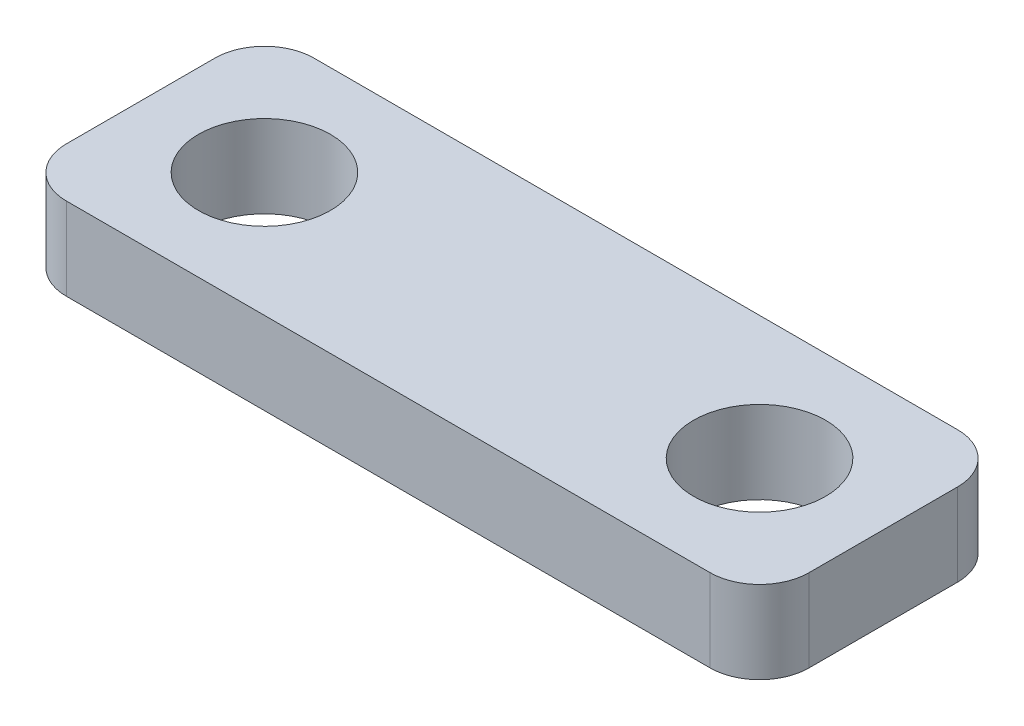
ISO-10303-21;
HEADER;
FILE_DESCRIPTION(('STEP AP214'),'2;1');
FILE_NAME('part.step','',(''),(''),'','','');
FILE_SCHEMA(('AUTOMOTIVE_DESIGN { 1 0 10303 214 1 1 1 1 }'));
ENDSEC;
DATA;
#1=APPLICATION_CONTEXT('core data for automotive mechanical design processes');
#2=APPLICATION_PROTOCOL_DEFINITION('international standard','automotive_design',2000,#1);
#3=PRODUCT_CONTEXT('',#1,'mechanical');
#4=PRODUCT('Part','Part','',(#3));
#5=PRODUCT_RELATED_PRODUCT_CATEGORY('part','',(#4));
#6=PRODUCT_DEFINITION_FORMATION('','',#4);
#7=PRODUCT_DEFINITION_CONTEXT('part definition',#1,'design');
#8=PRODUCT_DEFINITION('design','',#6,#7);
#9=PRODUCT_DEFINITION_SHAPE('','',#8);
#10=(LENGTH_UNIT() NAMED_UNIT(*) SI_UNIT(.MILLI.,.METRE.));
#11=(NAMED_UNIT(*) PLANE_ANGLE_UNIT() SI_UNIT($,.RADIAN.));
#12=(NAMED_UNIT(*) SI_UNIT($,.STERADIAN.) SOLID_ANGLE_UNIT());
#13=UNCERTAINTY_MEASURE_WITH_UNIT(LENGTH_MEASURE(1.E-05),#10,'distance_accuracy_value','');
#14=(GEOMETRIC_REPRESENTATION_CONTEXT(3) GLOBAL_UNCERTAINTY_ASSIGNED_CONTEXT((#13)) GLOBAL_UNIT_ASSIGNED_CONTEXT((#10,
#11,#12)) REPRESENTATION_CONTEXT('',''));
#15=CARTESIAN_POINT('',(0.,0.,0.));
#16=DIRECTION('',(0.,0.,1.));
#17=DIRECTION('',(1.,0.,0.));
#18=AXIS2_PLACEMENT_3D('',#15,#16,#17);
#19=CARTESIAN_POINT('',(22.5,5.,7.5));
#20=DIRECTION('',(-1.,0.,0.));
#21=DIRECTION('',(0.,0.,1.));
#22=AXIS2_PLACEMENT_3D('',#19,#20,#21);
#23=PLANE('',#22);
#24=DIRECTION('',(0.,0.,-1.));
#25=VECTOR('',#24,1.);
#26=CARTESIAN_POINT('',(22.5,5.,7.5));
#27=LINE('',#26,#25);
#28=CARTESIAN_POINT('',(22.5,5.,4.5));
#29=VERTEX_POINT('',#28);
#30=CARTESIAN_POINT('',(22.5,5.,-4.5));
#31=VERTEX_POINT('',#30);
#32=EDGE_CURVE('E128',#29,#31,#27,.T.);
#33=ORIENTED_EDGE('',*,*,#32,.F.);
#34=DIRECTION('',(0.,-1.,0.));
#35=VECTOR('',#34,1.);
#36=CARTESIAN_POINT('',(22.5,5.,4.5));
#37=LINE('',#36,#35);
#38=CARTESIAN_POINT('',(22.5,0.,4.5));
#39=VERTEX_POINT('',#38);
#40=EDGE_CURVE('E154',#29,#39,#37,.T.);
#41=ORIENTED_EDGE('',*,*,#40,.T.);
#42=DIRECTION('',(0.,0.,-1.));
#43=VECTOR('',#42,1.);
#44=CARTESIAN_POINT('',(22.5,0.,7.5));
#45=LINE('',#44,#43);
#46=CARTESIAN_POINT('',(22.5,0.,-4.5));
#47=VERTEX_POINT('',#46);
#48=EDGE_CURVE('E170',#39,#47,#45,.T.);
#49=ORIENTED_EDGE('',*,*,#48,.T.);
#50=DIRECTION('',(0.,-1.,0.));
#51=VECTOR('',#50,1.);
#52=CARTESIAN_POINT('',(22.5,5.,-4.5));
#53=LINE('',#52,#51);
#54=EDGE_CURVE('E152',#47,#31,#53,.F.);
#55=ORIENTED_EDGE('',*,*,#54,.T.);
#56=EDGE_LOOP('',(#33,#41,#49,#55));
#57=FACE_BOUND('',#56,.T.);
#58=ADVANCED_FACE('F34',(#57),#23,.F.);
#59=CARTESIAN_POINT('',(-22.5,5.,-7.5));
#60=DIRECTION('',(0.,0.,1.));
#61=DIRECTION('',(1.,0.,0.));
#62=AXIS2_PLACEMENT_3D('',#59,#60,#61);
#63=PLANE('',#62);
#64=DIRECTION('',(-1.,0.,0.));
#65=VECTOR('',#64,1.);
#66=CARTESIAN_POINT('',(-22.5,5.,-7.5));
#67=LINE('',#66,#65);
#68=CARTESIAN_POINT('',(19.5,5.,-7.5));
#69=VERTEX_POINT('',#68);
#70=CARTESIAN_POINT('',(-19.5,5.,-7.5));
#71=VERTEX_POINT('',#70);
#72=EDGE_CURVE('E131',#69,#71,#67,.T.);
#73=ORIENTED_EDGE('',*,*,#72,.F.);
#74=DIRECTION('',(0.,-1.,0.));
#75=VECTOR('',#74,1.);
#76=CARTESIAN_POINT('',(19.5,5.,-7.5));
#77=LINE('',#76,#75);
#78=CARTESIAN_POINT('',(19.5,0.,-7.5));
#79=VERTEX_POINT('',#78);
#80=EDGE_CURVE('E11',#69,#79,#77,.T.);
#81=ORIENTED_EDGE('',*,*,#80,.T.);
#82=DIRECTION('',(-1.,0.,0.));
#83=VECTOR('',#82,1.);
#84=CARTESIAN_POINT('',(-22.5,0.,-7.5));
#85=LINE('',#84,#83);
#86=CARTESIAN_POINT('',(-19.5,0.,-7.5));
#87=VERTEX_POINT('',#86);
#88=EDGE_CURVE('E133',#79,#87,#85,.T.);
#89=ORIENTED_EDGE('',*,*,#88,.T.);
#90=DIRECTION('',(0.,-1.,0.));
#91=VECTOR('',#90,1.);
#92=CARTESIAN_POINT('',(-19.5,5.,-7.5));
#93=LINE('',#92,#91);
#94=EDGE_CURVE('E43',#87,#71,#93,.F.);
#95=ORIENTED_EDGE('',*,*,#94,.T.);
#96=EDGE_LOOP('',(#73,#81,#89,#95));
#97=FACE_BOUND('',#96,.T.);
#98=ADVANCED_FACE('F179',(#97),#63,.F.);
#99=CARTESIAN_POINT('',(-22.5,5.,7.5));
#100=DIRECTION('',(1.,0.,0.));
#101=DIRECTION('',(0.,0.,-1.));
#102=AXIS2_PLACEMENT_3D('',#99,#100,#101);
#103=PLANE('',#102);
#104=DIRECTION('',(0.,0.,1.));
#105=VECTOR('',#104,1.);
#106=CARTESIAN_POINT('',(-22.5,0.,7.5));
#107=LINE('',#106,#105);
#108=CARTESIAN_POINT('',(-22.5,0.,-4.5));
#109=VERTEX_POINT('',#108);
#110=CARTESIAN_POINT('',(-22.5,0.,4.5));
#111=VERTEX_POINT('',#110);
#112=EDGE_CURVE('E129',#109,#111,#107,.T.);
#113=ORIENTED_EDGE('',*,*,#112,.T.);
#114=DIRECTION('',(0.,-1.,0.));
#115=VECTOR('',#114,1.);
#116=CARTESIAN_POINT('',(-22.5,5.,4.5));
#117=LINE('',#116,#115);
#118=CARTESIAN_POINT('',(-22.5,5.,4.5));
#119=VERTEX_POINT('',#118);
#120=EDGE_CURVE('E107',#111,#119,#117,.F.);
#121=ORIENTED_EDGE('',*,*,#120,.T.);
#122=DIRECTION('',(0.,0.,1.));
#123=VECTOR('',#122,1.);
#124=CARTESIAN_POINT('',(-22.5,5.,7.5));
#125=LINE('',#124,#123);
#126=CARTESIAN_POINT('',(-22.5,5.,-4.5));
#127=VERTEX_POINT('',#126);
#128=EDGE_CURVE('E173',#127,#119,#125,.T.);
#129=ORIENTED_EDGE('',*,*,#128,.F.);
#130=DIRECTION('',(0.,-1.,0.));
#131=VECTOR('',#130,1.);
#132=CARTESIAN_POINT('',(-22.5,5.,-4.5));
#133=LINE('',#132,#131);
#134=EDGE_CURVE('E112',#127,#109,#133,.T.);
#135=ORIENTED_EDGE('',*,*,#134,.T.);
#136=EDGE_LOOP('',(#113,#121,#129,#135));
#137=FACE_BOUND('',#136,.T.);
#138=ADVANCED_FACE('F187',(#137),#103,.F.);
#139=CARTESIAN_POINT('',(-22.5,5.,7.5));
#140=DIRECTION('',(0.,0.,-1.));
#141=DIRECTION('',(-1.,0.,0.));
#142=AXIS2_PLACEMENT_3D('',#139,#140,#141);
#143=PLANE('',#142);
#144=DIRECTION('',(1.,0.,0.));
#145=VECTOR('',#144,1.);
#146=CARTESIAN_POINT('',(-22.5,5.,7.5));
#147=LINE('',#146,#145);
#148=CARTESIAN_POINT('',(-19.5,5.,7.5));
#149=VERTEX_POINT('',#148);
#150=CARTESIAN_POINT('',(19.5,5.,7.5));
#151=VERTEX_POINT('',#150);
#152=EDGE_CURVE('E122',#149,#151,#147,.T.);
#153=ORIENTED_EDGE('',*,*,#152,.F.);
#154=DIRECTION('',(0.,-1.,0.));
#155=VECTOR('',#154,1.);
#156=CARTESIAN_POINT('',(-19.5,5.,7.5));
#157=LINE('',#156,#155);
#158=CARTESIAN_POINT('',(-19.5,0.,7.5));
#159=VERTEX_POINT('',#158);
#160=EDGE_CURVE('E106',#149,#159,#157,.T.);
#161=ORIENTED_EDGE('',*,*,#160,.T.);
#162=DIRECTION('',(1.,0.,0.));
#163=VECTOR('',#162,1.);
#164=CARTESIAN_POINT('',(-22.5,0.,7.5));
#165=LINE('',#164,#163);
#166=CARTESIAN_POINT('',(19.5,0.,7.5));
#167=VERTEX_POINT('',#166);
#168=EDGE_CURVE('E119',#159,#167,#165,.T.);
#169=ORIENTED_EDGE('',*,*,#168,.T.);
#170=DIRECTION('',(0.,-1.,0.));
#171=VECTOR('',#170,1.);
#172=CARTESIAN_POINT('',(19.5,5.,7.5));
#173=LINE('',#172,#171);
#174=EDGE_CURVE('E124',#167,#151,#173,.F.);
#175=ORIENTED_EDGE('',*,*,#174,.T.);
#176=EDGE_LOOP('',(#153,#161,#169,#175));
#177=FACE_BOUND('',#176,.T.);
#178=ADVANCED_FACE('F118',(#177),#143,.F.);
#179=CARTESIAN_POINT('',(0.,5.,0.));
#180=DIRECTION('',(0.,-1.,0.));
#181=DIRECTION('',(0.,0.,-1.));
#182=AXIS2_PLACEMENT_3D('',#179,#180,#181);
#183=PLANE('',#182);
#184=CARTESIAN_POINT('',(-15.,5.,0.));
#185=DIRECTION('',(0.,-1.,0.));
#186=DIRECTION('',(0.,0.,-1.));
#187=AXIS2_PLACEMENT_3D('',#184,#185,#186);
#188=CIRCLE('',#187,4.);
#189=CARTESIAN_POINT('',(-15.,5.,-4.));
#190=VERTEX_POINT('',#189);
#191=EDGE_CURVE('E167',#190,#190,#188,.T.);
#192=ORIENTED_EDGE('',*,*,#191,.T.);
#193=EDGE_LOOP('',(#192));
#194=FACE_BOUND('',#193,.T.);
#195=CARTESIAN_POINT('',(15.,5.,0.));
#196=DIRECTION('',(0.,-1.,0.));
#197=DIRECTION('',(0.,0.,-1.));
#198=AXIS2_PLACEMENT_3D('',#195,#196,#197);
#199=CIRCLE('',#198,4.);
#200=CARTESIAN_POINT('',(15.,5.,-4.));
#201=VERTEX_POINT('',#200);
#202=EDGE_CURVE('E159',#201,#201,#199,.T.);
#203=ORIENTED_EDGE('',*,*,#202,.T.);
#204=EDGE_LOOP('',(#203));
#205=FACE_BOUND('',#204,.T.);
#206=ORIENTED_EDGE('',*,*,#128,.T.);
#207=CARTESIAN_POINT('',(-19.5,5.,4.5));
#208=DIRECTION('',(0.,-1.,0.));
#209=DIRECTION('',(0.,0.,-1.));
#210=AXIS2_PLACEMENT_3D('',#207,#208,#209);
#211=CIRCLE('',#210,3.);
#212=EDGE_CURVE('E150',#119,#149,#211,.F.);
#213=ORIENTED_EDGE('',*,*,#212,.T.);
#214=ORIENTED_EDGE('',*,*,#152,.T.);
#215=CARTESIAN_POINT('',(19.5,5.,4.5));
#216=DIRECTION('',(0.,-1.,0.));
#217=DIRECTION('',(0.,0.,-1.));
#218=AXIS2_PLACEMENT_3D('',#215,#216,#217);
#219=CIRCLE('',#218,3.);
#220=EDGE_CURVE('E148',#151,#29,#219,.F.);
#221=ORIENTED_EDGE('',*,*,#220,.T.);
#222=ORIENTED_EDGE('',*,*,#32,.T.);
#223=CARTESIAN_POINT('',(19.5,5.,-4.5));
#224=DIRECTION('',(0.,-1.,0.));
#225=DIRECTION('',(0.,0.,-1.));
#226=AXIS2_PLACEMENT_3D('',#223,#224,#225);
#227=CIRCLE('',#226,3.);
#228=EDGE_CURVE('E57',#31,#69,#227,.F.);
#229=ORIENTED_EDGE('',*,*,#228,.T.);
#230=ORIENTED_EDGE('',*,*,#72,.T.);
#231=CARTESIAN_POINT('',(-19.5,5.,-4.5));
#232=DIRECTION('',(0.,-1.,0.));
#233=DIRECTION('',(0.,0.,-1.));
#234=AXIS2_PLACEMENT_3D('',#231,#232,#233);
#235=CIRCLE('',#234,3.);
#236=EDGE_CURVE('E145',#71,#127,#235,.F.);
#237=ORIENTED_EDGE('',*,*,#236,.T.);
#238=EDGE_LOOP('',(#206,#213,#214,#221,#222,#229,#230,#237));
#239=FACE_BOUND('',#238,.T.);
#240=ADVANCED_FACE('F185',(#194,#205,#239),#183,.F.);
#241=CARTESIAN_POINT('',(0.,0.,0.));
#242=DIRECTION('',(0.,-1.,0.));
#243=DIRECTION('',(0.,0.,-1.));
#244=AXIS2_PLACEMENT_3D('',#241,#242,#243);
#245=PLANE('',#244);
#246=CARTESIAN_POINT('',(-15.,0.,0.));
#247=DIRECTION('',(0.,-1.,0.));
#248=DIRECTION('',(0.,0.,-1.));
#249=AXIS2_PLACEMENT_3D('',#246,#247,#248);
#250=CIRCLE('',#249,4.);
#251=CARTESIAN_POINT('',(-15.,0.,-4.));
#252=VERTEX_POINT('',#251);
#253=EDGE_CURVE('E38',#252,#252,#250,.T.);
#254=ORIENTED_EDGE('',*,*,#253,.F.);
#255=EDGE_LOOP('',(#254));
#256=FACE_BOUND('',#255,.T.);
#257=CARTESIAN_POINT('',(15.,0.,0.));
#258=DIRECTION('',(0.,-1.,0.));
#259=DIRECTION('',(0.,0.,-1.));
#260=AXIS2_PLACEMENT_3D('',#257,#258,#259);
#261=CIRCLE('',#260,4.);
#262=CARTESIAN_POINT('',(15.,0.,-4.));
#263=VERTEX_POINT('',#262);
#264=EDGE_CURVE('E157',#263,#263,#261,.T.);
#265=ORIENTED_EDGE('',*,*,#264,.F.);
#266=EDGE_LOOP('',(#265));
#267=FACE_BOUND('',#266,.T.);
#268=ORIENTED_EDGE('',*,*,#168,.F.);
#269=CARTESIAN_POINT('',(-19.5,0.,4.5));
#270=DIRECTION('',(0.,-1.,0.));
#271=DIRECTION('',(0.,0.,-1.));
#272=AXIS2_PLACEMENT_3D('',#269,#270,#271);
#273=CIRCLE('',#272,3.);
#274=EDGE_CURVE('E102',#159,#111,#273,.T.);
#275=ORIENTED_EDGE('',*,*,#274,.T.);
#276=ORIENTED_EDGE('',*,*,#112,.F.);
#277=CARTESIAN_POINT('',(-19.5,0.,-4.5));
#278=DIRECTION('',(0.,-1.,0.));
#279=DIRECTION('',(0.,0.,-1.));
#280=AXIS2_PLACEMENT_3D('',#277,#278,#279);
#281=CIRCLE('',#280,3.);
#282=EDGE_CURVE('E123',#109,#87,#281,.T.);
#283=ORIENTED_EDGE('',*,*,#282,.T.);
#284=ORIENTED_EDGE('',*,*,#88,.F.);
#285=CARTESIAN_POINT('',(19.5,0.,-4.5));
#286=DIRECTION('',(0.,-1.,0.));
#287=DIRECTION('',(0.,0.,-1.));
#288=AXIS2_PLACEMENT_3D('',#285,#286,#287);
#289=CIRCLE('',#288,3.);
#290=EDGE_CURVE('E139',#79,#47,#289,.T.);
#291=ORIENTED_EDGE('',*,*,#290,.T.);
#292=ORIENTED_EDGE('',*,*,#48,.F.);
#293=CARTESIAN_POINT('',(19.5,0.,4.5));
#294=DIRECTION('',(0.,-1.,0.));
#295=DIRECTION('',(0.,0.,-1.));
#296=AXIS2_PLACEMENT_3D('',#293,#294,#295);
#297=CIRCLE('',#296,3.);
#298=EDGE_CURVE('E113',#39,#167,#297,.T.);
#299=ORIENTED_EDGE('',*,*,#298,.T.);
#300=EDGE_LOOP('',(#268,#275,#276,#283,#284,#291,#292,#299));
#301=FACE_BOUND('',#300,.T.);
#302=ADVANCED_FACE('F126',(#256,#267,#301),#245,.T.);
#303=CARTESIAN_POINT('',(-19.5,5.,4.5));
#304=DIRECTION('',(0.,-1.,0.));
#305=DIRECTION('',(0.,0.,-1.));
#306=AXIS2_PLACEMENT_3D('',#303,#304,#305);
#307=CYLINDRICAL_SURFACE('',#306,3.);
#308=ORIENTED_EDGE('',*,*,#212,.F.);
#309=ORIENTED_EDGE('',*,*,#120,.F.);
#310=ORIENTED_EDGE('',*,*,#274,.F.);
#311=ORIENTED_EDGE('',*,*,#160,.F.);
#312=EDGE_LOOP('',(#308,#309,#310,#311));
#313=FACE_BOUND('',#312,.T.);
#314=ADVANCED_FACE('F105',(#313),#307,.T.);
#315=CARTESIAN_POINT('',(19.5,5.,4.5));
#316=DIRECTION('',(0.,-1.,0.));
#317=DIRECTION('',(0.,0.,-1.));
#318=AXIS2_PLACEMENT_3D('',#315,#316,#317);
#319=CYLINDRICAL_SURFACE('',#318,3.);
#320=ORIENTED_EDGE('',*,*,#220,.F.);
#321=ORIENTED_EDGE('',*,*,#174,.F.);
#322=ORIENTED_EDGE('',*,*,#298,.F.);
#323=ORIENTED_EDGE('',*,*,#40,.F.);
#324=EDGE_LOOP('',(#320,#321,#322,#323));
#325=FACE_BOUND('',#324,.T.);
#326=ADVANCED_FACE('F205',(#325),#319,.T.);
#327=CARTESIAN_POINT('',(19.5,5.,-4.5));
#328=DIRECTION('',(0.,-1.,0.));
#329=DIRECTION('',(0.,0.,-1.));
#330=AXIS2_PLACEMENT_3D('',#327,#328,#329);
#331=CYLINDRICAL_SURFACE('',#330,3.);
#332=ORIENTED_EDGE('',*,*,#228,.F.);
#333=ORIENTED_EDGE('',*,*,#54,.F.);
#334=ORIENTED_EDGE('',*,*,#290,.F.);
#335=ORIENTED_EDGE('',*,*,#80,.F.);
#336=EDGE_LOOP('',(#332,#333,#334,#335));
#337=FACE_BOUND('',#336,.T.);
#338=ADVANCED_FACE('F207',(#337),#331,.T.);
#339=CARTESIAN_POINT('',(-19.5,5.,-4.5));
#340=DIRECTION('',(0.,-1.,0.));
#341=DIRECTION('',(0.,0.,-1.));
#342=AXIS2_PLACEMENT_3D('',#339,#340,#341);
#343=CYLINDRICAL_SURFACE('',#342,3.);
#344=ORIENTED_EDGE('',*,*,#236,.F.);
#345=ORIENTED_EDGE('',*,*,#94,.F.);
#346=ORIENTED_EDGE('',*,*,#282,.F.);
#347=ORIENTED_EDGE('',*,*,#134,.F.);
#348=EDGE_LOOP('',(#344,#345,#346,#347));
#349=FACE_BOUND('',#348,.T.);
#350=ADVANCED_FACE('F36',(#349),#343,.T.);
#351=CARTESIAN_POINT('',(15.,-5.,0.));
#352=DIRECTION('',(0.,1.,0.));
#353=DIRECTION('',(0.,0.,1.));
#354=AXIS2_PLACEMENT_3D('',#351,#352,#353);
#355=CYLINDRICAL_SURFACE('',#354,4.);
#356=ORIENTED_EDGE('',*,*,#264,.T.);
#357=EDGE_LOOP('',(#356));
#358=FACE_BOUND('',#357,.T.);
#359=ORIENTED_EDGE('',*,*,#202,.F.);
#360=EDGE_LOOP('',(#359));
#361=FACE_BOUND('',#360,.T.);
#362=ADVANCED_FACE('F214',(#358,#361),#355,.F.);
#363=CARTESIAN_POINT('',(-15.,-5.,0.));
#364=DIRECTION('',(0.,1.,0.));
#365=DIRECTION('',(0.,0.,1.));
#366=AXIS2_PLACEMENT_3D('',#363,#364,#365);
#367=CYLINDRICAL_SURFACE('',#366,4.);
#368=ORIENTED_EDGE('',*,*,#253,.T.);
#369=EDGE_LOOP('',(#368));
#370=FACE_BOUND('',#369,.T.);
#371=ORIENTED_EDGE('',*,*,#191,.F.);
#372=EDGE_LOOP('',(#371));
#373=FACE_BOUND('',#372,.T.);
#374=ADVANCED_FACE('F221',(#370,#373),#367,.F.);
#375=CLOSED_SHELL('',(#58,#98,#138,#178,#240,#302,#314,#326,#338,#350,#362,#374));
#376=MANIFOLD_SOLID_BREP('B2',#375);
#377=ADVANCED_BREP_SHAPE_REPRESENTATION('',(#18,#376),#14);
#378=SHAPE_DEFINITION_REPRESENTATION(#9,#377);
ENDSEC;
END-ISO-10303-21;
